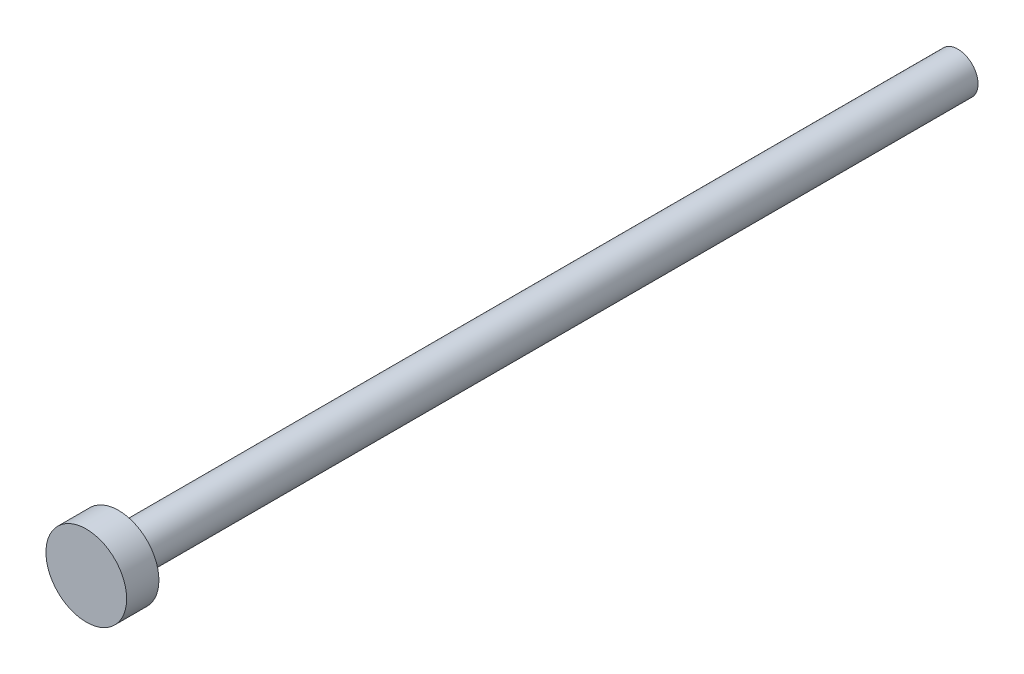
ISO-10303-21;
HEADER;
FILE_DESCRIPTION(('STEP AP214'),'2;1');
FILE_NAME('part.step','',(''),(''),'','','');
FILE_SCHEMA(('AUTOMOTIVE_DESIGN { 1 0 10303 214 1 1 1 1 }'));
ENDSEC;
DATA;
#1=APPLICATION_CONTEXT('core data for automotive mechanical design processes');
#2=APPLICATION_PROTOCOL_DEFINITION('international standard','automotive_design',2000,#1);
#3=PRODUCT_CONTEXT('',#1,'mechanical');
#4=PRODUCT('Part','Part','',(#3));
#5=PRODUCT_RELATED_PRODUCT_CATEGORY('part','',(#4));
#6=PRODUCT_DEFINITION_FORMATION('','',#4);
#7=PRODUCT_DEFINITION_CONTEXT('part definition',#1,'design');
#8=PRODUCT_DEFINITION('design','',#6,#7);
#9=PRODUCT_DEFINITION_SHAPE('','',#8);
#10=(LENGTH_UNIT() NAMED_UNIT(*) SI_UNIT(.MILLI.,.METRE.));
#11=(NAMED_UNIT(*) PLANE_ANGLE_UNIT() SI_UNIT($,.RADIAN.));
#12=(NAMED_UNIT(*) SI_UNIT($,.STERADIAN.) SOLID_ANGLE_UNIT());
#13=UNCERTAINTY_MEASURE_WITH_UNIT(LENGTH_MEASURE(1.E-05),#10,'distance_accuracy_value','');
#14=(GEOMETRIC_REPRESENTATION_CONTEXT(3) GLOBAL_UNCERTAINTY_ASSIGNED_CONTEXT((#13)) GLOBAL_UNIT_ASSIGNED_CONTEXT((#10,
#11,#12)) REPRESENTATION_CONTEXT('',''));
#15=CARTESIAN_POINT('',(0.,0.,0.));
#16=DIRECTION('',(0.,0.,1.));
#17=DIRECTION('',(1.,0.,0.));
#18=AXIS2_PLACEMENT_3D('',#15,#16,#17);
#19=CARTESIAN_POINT('',(0.,0.,1.));
#20=DIRECTION('',(0.,0.,-1.));
#21=DIRECTION('',(-1.,0.,0.));
#22=AXIS2_PLACEMENT_3D('',#19,#20,#21);
#23=CYLINDRICAL_SURFACE('',#22,1.25);
#24=CARTESIAN_POINT('',(0.,0.,1.));
#25=DIRECTION('',(0.,0.,1.));
#26=DIRECTION('',(1.,0.,0.));
#27=AXIS2_PLACEMENT_3D('',#24,#25,#26);
#28=CIRCLE('',#27,1.25);
#29=CARTESIAN_POINT('',(1.25,0.,1.));
#30=VERTEX_POINT('',#29);
#31=EDGE_CURVE('E44',#30,#30,#28,.T.);
#32=ORIENTED_EDGE('',*,*,#31,.F.);
#33=EDGE_LOOP('',(#32));
#34=FACE_BOUND('',#33,.T.);
#35=CARTESIAN_POINT('',(0.,0.,0.));
#36=DIRECTION('',(0.,0.,1.));
#37=DIRECTION('',(1.,0.,0.));
#38=AXIS2_PLACEMENT_3D('',#35,#36,#37);
#39=CIRCLE('',#38,1.25);
#40=CARTESIAN_POINT('',(1.25,0.,0.));
#41=VERTEX_POINT('',#40);
#42=EDGE_CURVE('E39',#41,#41,#39,.T.);
#43=ORIENTED_EDGE('',*,*,#42,.T.);
#44=EDGE_LOOP('',(#43));
#45=FACE_BOUND('',#44,.T.);
#46=ADVANCED_FACE('F36',(#34,#45),#23,.T.);
#47=CARTESIAN_POINT('',(0.,0.,1.));
#48=DIRECTION('',(0.,0.,1.));
#49=DIRECTION('',(1.,0.,0.));
#50=AXIS2_PLACEMENT_3D('',#47,#48,#49);
#51=PLANE('',#50);
#52=ORIENTED_EDGE('',*,*,#31,.T.);
#53=EDGE_LOOP('',(#52));
#54=FACE_BOUND('',#53,.T.);
#55=ADVANCED_FACE('F64',(#54),#51,.T.);
#56=CARTESIAN_POINT('',(0.,0.,0.));
#57=DIRECTION('',(0.,0.,1.));
#58=DIRECTION('',(1.,0.,0.));
#59=AXIS2_PLACEMENT_3D('',#56,#57,#58);
#60=PLANE('',#59);
#61=CARTESIAN_POINT('',(0.,0.,0.));
#62=DIRECTION('',(0.,0.,-1.));
#63=DIRECTION('',(-1.,0.,0.));
#64=AXIS2_PLACEMENT_3D('',#61,#62,#63);
#65=CIRCLE('',#64,0.625);
#66=CARTESIAN_POINT('',(-0.625,0.,0.));
#67=VERTEX_POINT('',#66);
#68=EDGE_CURVE('E10',#67,#67,#65,.T.);
#69=ORIENTED_EDGE('',*,*,#68,.F.);
#70=EDGE_LOOP('',(#69));
#71=FACE_BOUND('',#70,.T.);
#72=ORIENTED_EDGE('',*,*,#42,.F.);
#73=EDGE_LOOP('',(#72));
#74=FACE_BOUND('',#73,.T.);
#75=ADVANCED_FACE('F61',(#71,#74),#60,.F.);
#76=CARTESIAN_POINT('',(0.,0.,-26.));
#77=DIRECTION('',(0.,0.,1.));
#78=DIRECTION('',(1.,0.,0.));
#79=AXIS2_PLACEMENT_3D('',#76,#77,#78);
#80=CYLINDRICAL_SURFACE('',#79,0.625);
#81=CARTESIAN_POINT('',(0.,0.,-26.));
#82=DIRECTION('',(0.,0.,-1.));
#83=DIRECTION('',(-1.,0.,0.));
#84=AXIS2_PLACEMENT_3D('',#81,#82,#83);
#85=CIRCLE('',#84,0.625);
#86=CARTESIAN_POINT('',(-0.625,0.,-26.));
#87=VERTEX_POINT('',#86);
#88=EDGE_CURVE('E51',#87,#87,#85,.T.);
#89=ORIENTED_EDGE('',*,*,#88,.F.);
#90=EDGE_LOOP('',(#89));
#91=FACE_BOUND('',#90,.T.);
#92=ORIENTED_EDGE('',*,*,#68,.T.);
#93=EDGE_LOOP('',(#92));
#94=FACE_BOUND('',#93,.T.);
#95=ADVANCED_FACE('F63',(#91,#94),#80,.T.);
#96=CARTESIAN_POINT('',(0.,0.,-26.));
#97=DIRECTION('',(0.,0.,-1.));
#98=DIRECTION('',(-1.,0.,0.));
#99=AXIS2_PLACEMENT_3D('',#96,#97,#98);
#100=PLANE('',#99);
#101=ORIENTED_EDGE('',*,*,#88,.T.);
#102=EDGE_LOOP('',(#101));
#103=FACE_BOUND('',#102,.T.);
#104=ADVANCED_FACE('F70',(#103),#100,.T.);
#105=CLOSED_SHELL('',(#46,#55,#75,#95,#104));
#106=MANIFOLD_SOLID_BREP('B2',#105);
#107=ADVANCED_BREP_SHAPE_REPRESENTATION('',(#18,#106),#14);
#108=SHAPE_DEFINITION_REPRESENTATION(#9,#107);
ENDSEC;
END-ISO-10303-21;
